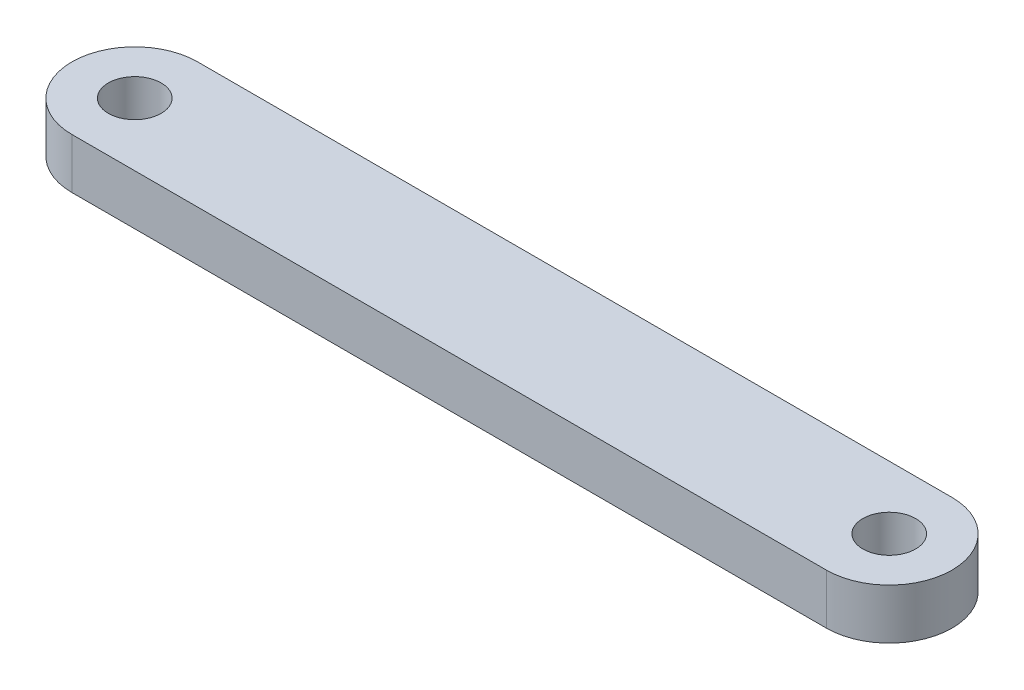
ISO-10303-21;
HEADER;
FILE_DESCRIPTION(('STEP AP214'),'2;1');
FILE_NAME('part.step','',(''),(''),'','','');
FILE_SCHEMA(('AUTOMOTIVE_DESIGN { 1 0 10303 214 1 1 1 1 }'));
ENDSEC;
DATA;
#1=APPLICATION_CONTEXT('core data for automotive mechanical design processes');
#2=APPLICATION_PROTOCOL_DEFINITION('international standard','automotive_design',2000,#1);
#3=PRODUCT_CONTEXT('',#1,'mechanical');
#4=PRODUCT('Part','Part','',(#3));
#5=PRODUCT_RELATED_PRODUCT_CATEGORY('part','',(#4));
#6=PRODUCT_DEFINITION_FORMATION('','',#4);
#7=PRODUCT_DEFINITION_CONTEXT('part definition',#1,'design');
#8=PRODUCT_DEFINITION('design','',#6,#7);
#9=PRODUCT_DEFINITION_SHAPE('','',#8);
#10=(LENGTH_UNIT() NAMED_UNIT(*) SI_UNIT(.MILLI.,.METRE.));
#11=(NAMED_UNIT(*) PLANE_ANGLE_UNIT() SI_UNIT($,.RADIAN.));
#12=(NAMED_UNIT(*) SI_UNIT($,.STERADIAN.) SOLID_ANGLE_UNIT());
#13=UNCERTAINTY_MEASURE_WITH_UNIT(LENGTH_MEASURE(1.E-05),#10,'distance_accuracy_value','');
#14=(GEOMETRIC_REPRESENTATION_CONTEXT(3) GLOBAL_UNCERTAINTY_ASSIGNED_CONTEXT((#13)) GLOBAL_UNIT_ASSIGNED_CONTEXT((#10,
#11,#12)) REPRESENTATION_CONTEXT('',''));
#15=CARTESIAN_POINT('',(0.,0.,0.));
#16=DIRECTION('',(0.,0.,1.));
#17=DIRECTION('',(1.,0.,0.));
#18=AXIS2_PLACEMENT_3D('',#15,#16,#17);
#19=CARTESIAN_POINT('',(0.,2.,0.));
#20=DIRECTION('',(0.,1.,0.));
#21=DIRECTION('',(0.,0.,1.));
#22=AXIS2_PLACEMENT_3D('',#19,#20,#21);
#23=PLANE('',#22);
#24=CARTESIAN_POINT('',(0.,2.,0.));
#25=DIRECTION('',(0.,1.,0.));
#26=DIRECTION('',(0.,0.,1.));
#27=AXIS2_PLACEMENT_3D('',#24,#25,#26);
#28=CIRCLE('',#27,1.05);
#29=CARTESIAN_POINT('',(0.,2.,1.05));
#30=VERTEX_POINT('',#29);
#31=EDGE_CURVE('E103',#30,#30,#28,.T.);
#32=ORIENTED_EDGE('',*,*,#31,.F.);
#33=EDGE_LOOP('',(#32));
#34=FACE_BOUND('',#33,.T.);
#35=CARTESIAN_POINT('',(0.,2.,0.));
#36=DIRECTION('',(0.,1.,0.));
#37=DIRECTION('',(0.,0.,1.));
#38=AXIS2_PLACEMENT_3D('',#35,#36,#37);
#39=CIRCLE('',#38,2.5);
#40=CARTESIAN_POINT('',(0.,2.,-2.5));
#41=VERTEX_POINT('',#40);
#42=CARTESIAN_POINT('',(0.,2.,2.5));
#43=VERTEX_POINT('',#42);
#44=EDGE_CURVE('E88',#41,#43,#39,.T.);
#45=ORIENTED_EDGE('',*,*,#44,.T.);
#46=DIRECTION('',(1.,0.,0.));
#47=VECTOR('',#46,1.);
#48=CARTESIAN_POINT('',(0.,2.,2.5));
#49=LINE('',#48,#47);
#50=CARTESIAN_POINT('',(30.,2.,2.5));
#51=VERTEX_POINT('',#50);
#52=EDGE_CURVE('E83',#43,#51,#49,.T.);
#53=ORIENTED_EDGE('',*,*,#52,.T.);
#54=CARTESIAN_POINT('',(30.,2.,0.));
#55=DIRECTION('',(0.,1.,0.));
#56=DIRECTION('',(0.,0.,1.));
#57=AXIS2_PLACEMENT_3D('',#54,#55,#56);
#58=CIRCLE('',#57,2.5);
#59=CARTESIAN_POINT('',(30.,2.,-2.5));
#60=VERTEX_POINT('',#59);
#61=EDGE_CURVE('E86',#51,#60,#58,.T.);
#62=ORIENTED_EDGE('',*,*,#61,.T.);
#63=DIRECTION('',(-1.,0.,0.));
#64=VECTOR('',#63,1.);
#65=CARTESIAN_POINT('',(0.,2.,-2.5));
#66=LINE('',#65,#64);
#67=EDGE_CURVE('E53',#60,#41,#66,.T.);
#68=ORIENTED_EDGE('',*,*,#67,.T.);
#69=EDGE_LOOP('',(#45,#53,#62,#68));
#70=FACE_BOUND('',#69,.T.);
#71=CARTESIAN_POINT('',(30.,2.,0.));
#72=DIRECTION('',(0.,1.,0.));
#73=DIRECTION('',(0.,0.,1.));
#74=AXIS2_PLACEMENT_3D('',#71,#72,#73);
#75=CIRCLE('',#74,1.04999999999999);
#76=CARTESIAN_POINT('',(30.,2.,1.04999999999999));
#77=VERTEX_POINT('',#76);
#78=EDGE_CURVE('E118',#77,#77,#75,.T.);
#79=ORIENTED_EDGE('',*,*,#78,.F.);
#80=EDGE_LOOP('',(#79));
#81=FACE_BOUND('',#80,.T.);
#82=ADVANCED_FACE('F36',(#34,#70,#81),#23,.T.);
#83=CARTESIAN_POINT('',(0.,0.,0.));
#84=DIRECTION('',(0.,1.,0.));
#85=DIRECTION('',(0.,0.,1.));
#86=AXIS2_PLACEMENT_3D('',#83,#84,#85);
#87=PLANE('',#86);
#88=CARTESIAN_POINT('',(0.,0.,0.));
#89=DIRECTION('',(0.,1.,0.));
#90=DIRECTION('',(0.,0.,1.));
#91=AXIS2_PLACEMENT_3D('',#88,#89,#90);
#92=CIRCLE('',#91,2.5);
#93=CARTESIAN_POINT('',(0.,0.,-2.5));
#94=VERTEX_POINT('',#93);
#95=CARTESIAN_POINT('',(0.,0.,2.5));
#96=VERTEX_POINT('',#95);
#97=EDGE_CURVE('E100',#94,#96,#92,.T.);
#98=ORIENTED_EDGE('',*,*,#97,.F.);
#99=DIRECTION('',(-1.,0.,0.));
#100=VECTOR('',#99,1.);
#101=CARTESIAN_POINT('',(0.,0.,-2.5));
#102=LINE('',#101,#100);
#103=CARTESIAN_POINT('',(30.,0.,-2.5));
#104=VERTEX_POINT('',#103);
#105=EDGE_CURVE('E76',#104,#94,#102,.T.);
#106=ORIENTED_EDGE('',*,*,#105,.F.);
#107=CARTESIAN_POINT('',(30.,0.,0.));
#108=DIRECTION('',(0.,1.,0.));
#109=DIRECTION('',(0.,0.,1.));
#110=AXIS2_PLACEMENT_3D('',#107,#108,#109);
#111=CIRCLE('',#110,2.5);
#112=CARTESIAN_POINT('',(30.,0.,2.5));
#113=VERTEX_POINT('',#112);
#114=EDGE_CURVE('E70',#113,#104,#111,.T.);
#115=ORIENTED_EDGE('',*,*,#114,.F.);
#116=DIRECTION('',(1.,0.,0.));
#117=VECTOR('',#116,1.);
#118=CARTESIAN_POINT('',(0.,0.,2.5));
#119=LINE('',#118,#117);
#120=EDGE_CURVE('E92',#96,#113,#119,.T.);
#121=ORIENTED_EDGE('',*,*,#120,.F.);
#122=EDGE_LOOP('',(#98,#106,#115,#121));
#123=FACE_BOUND('',#122,.T.);
#124=CARTESIAN_POINT('',(0.,0.,0.));
#125=DIRECTION('',(0.,1.,0.));
#126=DIRECTION('',(0.,0.,1.));
#127=AXIS2_PLACEMENT_3D('',#124,#125,#126);
#128=CIRCLE('',#127,1.05);
#129=CARTESIAN_POINT('',(0.,0.,1.05));
#130=VERTEX_POINT('',#129);
#131=EDGE_CURVE('E115',#130,#130,#128,.T.);
#132=ORIENTED_EDGE('',*,*,#131,.T.);
#133=EDGE_LOOP('',(#132));
#134=FACE_BOUND('',#133,.T.);
#135=CARTESIAN_POINT('',(30.,0.,0.));
#136=DIRECTION('',(0.,1.,0.));
#137=DIRECTION('',(0.,0.,1.));
#138=AXIS2_PLACEMENT_3D('',#135,#136,#137);
#139=CIRCLE('',#138,1.04999999999999);
#140=CARTESIAN_POINT('',(30.,0.,1.04999999999999));
#141=VERTEX_POINT('',#140);
#142=EDGE_CURVE('E121',#141,#141,#139,.T.);
#143=ORIENTED_EDGE('',*,*,#142,.T.);
#144=EDGE_LOOP('',(#143));
#145=FACE_BOUND('',#144,.T.);
#146=ADVANCED_FACE('F111',(#123,#134,#145),#87,.F.);
#147=CARTESIAN_POINT('',(0.,2.,0.));
#148=DIRECTION('',(0.,-1.,0.));
#149=DIRECTION('',(0.,0.,-1.));
#150=AXIS2_PLACEMENT_3D('',#147,#148,#149);
#151=CYLINDRICAL_SURFACE('',#150,2.5);
#152=ORIENTED_EDGE('',*,*,#97,.T.);
#153=DIRECTION('',(0.,-1.,0.));
#154=VECTOR('',#153,1.);
#155=CARTESIAN_POINT('',(0.,2.,2.5));
#156=LINE('',#155,#154);
#157=EDGE_CURVE('E11',#43,#96,#156,.T.);
#158=ORIENTED_EDGE('',*,*,#157,.F.);
#159=ORIENTED_EDGE('',*,*,#44,.F.);
#160=DIRECTION('',(0.,-1.,0.));
#161=VECTOR('',#160,1.);
#162=CARTESIAN_POINT('',(0.,2.,-2.5));
#163=LINE('',#162,#161);
#164=EDGE_CURVE('E96',#41,#94,#163,.T.);
#165=ORIENTED_EDGE('',*,*,#164,.T.);
#166=EDGE_LOOP('',(#152,#158,#159,#165));
#167=FACE_BOUND('',#166,.T.);
#168=ADVANCED_FACE('F38',(#167),#151,.T.);
#169=CARTESIAN_POINT('',(0.,2.,2.5));
#170=DIRECTION('',(0.,0.,-1.));
#171=DIRECTION('',(-1.,0.,0.));
#172=AXIS2_PLACEMENT_3D('',#169,#170,#171);
#173=PLANE('',#172);
#174=ORIENTED_EDGE('',*,*,#120,.T.);
#175=DIRECTION('',(0.,-1.,0.));
#176=VECTOR('',#175,1.);
#177=CARTESIAN_POINT('',(30.,2.,2.5));
#178=LINE('',#177,#176);
#179=EDGE_CURVE('E45',#51,#113,#178,.T.);
#180=ORIENTED_EDGE('',*,*,#179,.F.);
#181=ORIENTED_EDGE('',*,*,#52,.F.);
#182=ORIENTED_EDGE('',*,*,#157,.T.);
#183=EDGE_LOOP('',(#174,#180,#181,#182));
#184=FACE_BOUND('',#183,.T.);
#185=ADVANCED_FACE('F91',(#184),#173,.F.);
#186=CARTESIAN_POINT('',(30.,2.,0.));
#187=DIRECTION('',(0.,-1.,0.));
#188=DIRECTION('',(0.,0.,-1.));
#189=AXIS2_PLACEMENT_3D('',#186,#187,#188);
#190=CYLINDRICAL_SURFACE('',#189,2.5);
#191=ORIENTED_EDGE('',*,*,#114,.T.);
#192=DIRECTION('',(0.,-1.,0.));
#193=VECTOR('',#192,1.);
#194=CARTESIAN_POINT('',(30.,2.,-2.5));
#195=LINE('',#194,#193);
#196=EDGE_CURVE('E93',#60,#104,#195,.T.);
#197=ORIENTED_EDGE('',*,*,#196,.F.);
#198=ORIENTED_EDGE('',*,*,#61,.F.);
#199=ORIENTED_EDGE('',*,*,#179,.T.);
#200=EDGE_LOOP('',(#191,#197,#198,#199));
#201=FACE_BOUND('',#200,.T.);
#202=ADVANCED_FACE('F94',(#201),#190,.T.);
#203=CARTESIAN_POINT('',(0.,2.,-2.5));
#204=DIRECTION('',(0.,0.,1.));
#205=DIRECTION('',(1.,0.,0.));
#206=AXIS2_PLACEMENT_3D('',#203,#204,#205);
#207=PLANE('',#206);
#208=ORIENTED_EDGE('',*,*,#105,.T.);
#209=ORIENTED_EDGE('',*,*,#164,.F.);
#210=ORIENTED_EDGE('',*,*,#67,.F.);
#211=ORIENTED_EDGE('',*,*,#196,.T.);
#212=EDGE_LOOP('',(#208,#209,#210,#211));
#213=FACE_BOUND('',#212,.T.);
#214=ADVANCED_FACE('F108',(#213),#207,.F.);
#215=CARTESIAN_POINT('',(0.,2.,0.));
#216=DIRECTION('',(0.,-1.,0.));
#217=DIRECTION('',(0.,0.,-1.));
#218=AXIS2_PLACEMENT_3D('',#215,#216,#217);
#219=CYLINDRICAL_SURFACE('',#218,1.05);
#220=ORIENTED_EDGE('',*,*,#31,.T.);
#221=EDGE_LOOP('',(#220));
#222=FACE_BOUND('',#221,.T.);
#223=ORIENTED_EDGE('',*,*,#131,.F.);
#224=EDGE_LOOP('',(#223));
#225=FACE_BOUND('',#224,.T.);
#226=ADVANCED_FACE('F138',(#222,#225),#219,.F.);
#227=CARTESIAN_POINT('',(30.,2.,0.));
#228=DIRECTION('',(0.,-1.,0.));
#229=DIRECTION('',(0.,0.,-1.));
#230=AXIS2_PLACEMENT_3D('',#227,#228,#229);
#231=CYLINDRICAL_SURFACE('',#230,1.04999999999999);
#232=ORIENTED_EDGE('',*,*,#78,.T.);
#233=EDGE_LOOP('',(#232));
#234=FACE_BOUND('',#233,.T.);
#235=ORIENTED_EDGE('',*,*,#142,.F.);
#236=EDGE_LOOP('',(#235));
#237=FACE_BOUND('',#236,.T.);
#238=ADVANCED_FACE('F127',(#234,#237),#231,.F.);
#239=CLOSED_SHELL('',(#82,#146,#168,#185,#202,#214,#226,#238));
#240=MANIFOLD_SOLID_BREP('B2',#239);
#241=ADVANCED_BREP_SHAPE_REPRESENTATION('',(#18,#240),#14);
#242=SHAPE_DEFINITION_REPRESENTATION(#9,#241);
ENDSEC;
END-ISO-10303-21;
